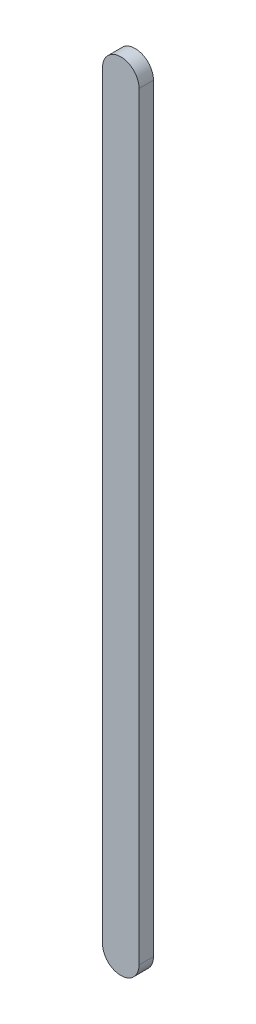
ISO-10303-21;
HEADER;
FILE_DESCRIPTION(('STEP AP214'),'2;1');
FILE_NAME('part.step','',(''),(''),'','','');
FILE_SCHEMA(('AUTOMOTIVE_DESIGN { 1 0 10303 214 1 1 1 1 }'));
ENDSEC;
DATA;
#1=APPLICATION_CONTEXT('core data for automotive mechanical design processes');
#2=APPLICATION_PROTOCOL_DEFINITION('international standard','automotive_design',2000,#1);
#3=PRODUCT_CONTEXT('',#1,'mechanical');
#4=PRODUCT('Part','Part','',(#3));
#5=PRODUCT_RELATED_PRODUCT_CATEGORY('part','',(#4));
#6=PRODUCT_DEFINITION_FORMATION('','',#4);
#7=PRODUCT_DEFINITION_CONTEXT('part definition',#1,'design');
#8=PRODUCT_DEFINITION('design','',#6,#7);
#9=PRODUCT_DEFINITION_SHAPE('','',#8);
#10=(LENGTH_UNIT() NAMED_UNIT(*) SI_UNIT(.MILLI.,.METRE.));
#11=(NAMED_UNIT(*) PLANE_ANGLE_UNIT() SI_UNIT($,.RADIAN.));
#12=(NAMED_UNIT(*) SI_UNIT($,.STERADIAN.) SOLID_ANGLE_UNIT());
#13=UNCERTAINTY_MEASURE_WITH_UNIT(LENGTH_MEASURE(1.E-05),#10,'distance_accuracy_value','');
#14=(GEOMETRIC_REPRESENTATION_CONTEXT(3) GLOBAL_UNCERTAINTY_ASSIGNED_CONTEXT((#13)) GLOBAL_UNIT_ASSIGNED_CONTEXT((#10,
#11,#12)) REPRESENTATION_CONTEXT('',''));
#15=CARTESIAN_POINT('',(0.,0.,0.));
#16=DIRECTION('',(0.,0.,1.));
#17=DIRECTION('',(1.,0.,0.));
#18=AXIS2_PLACEMENT_3D('',#15,#16,#17);
#19=CARTESIAN_POINT('',(151.384,92.075,0.));
#20=DIRECTION('',(-1.,0.,0.));
#21=DIRECTION('',(0.,1.,0.));
#22=AXIS2_PLACEMENT_3D('',#19,#20,#21);
#23=PLANE('',#22);
#24=DIRECTION('',(0.,1.,0.));
#25=VECTOR('',#24,1.);
#26=CARTESIAN_POINT('',(151.384,92.075,0.1999996));
#27=LINE('',#26,#25);
#28=CARTESIAN_POINT('',(151.384,92.075,0.1999996));
#29=VERTEX_POINT('',#28);
#30=CARTESIAN_POINT('',(151.384,102.616,0.1999996));
#31=VERTEX_POINT('',#30);
#32=EDGE_CURVE('E11',#29,#31,#27,.T.);
#33=ORIENTED_EDGE('',*,*,#32,.F.);
#34=DIRECTION('',(0.,0.,1.));
#35=VECTOR('',#34,1.);
#36=CARTESIAN_POINT('',(151.384,92.075,0.));
#37=LINE('',#36,#35);
#38=CARTESIAN_POINT('',(151.384,92.075,0.));
#39=VERTEX_POINT('',#38);
#40=EDGE_CURVE('E24',#39,#29,#37,.T.);
#41=ORIENTED_EDGE('',*,*,#40,.F.);
#42=DIRECTION('',(0.,1.,0.));
#43=VECTOR('',#42,1.);
#44=CARTESIAN_POINT('',(151.384,92.075,0.));
#45=LINE('',#44,#43);
#46=CARTESIAN_POINT('',(151.384,102.616,0.));
#47=VERTEX_POINT('',#46);
#48=EDGE_CURVE('E75',#39,#47,#45,.T.);
#49=ORIENTED_EDGE('',*,*,#48,.T.);
#50=DIRECTION('',(0.,0.,1.));
#51=VECTOR('',#50,1.);
#52=CARTESIAN_POINT('',(151.384,102.616,0.));
#53=LINE('',#52,#51);
#54=EDGE_CURVE('E37',#47,#31,#53,.T.);
#55=ORIENTED_EDGE('',*,*,#54,.T.);
#56=EDGE_LOOP('',(#33,#41,#49,#55));
#57=FACE_BOUND('',#56,.T.);
#58=ADVANCED_FACE('F17',(#57),#23,.F.);
#59=CARTESIAN_POINT('',(151.13,102.616,0.));
#60=DIRECTION('',(0.,0.,-1.));
#61=DIRECTION('',(1.,0.,0.));
#62=AXIS2_PLACEMENT_3D('',#59,#60,#61);
#63=CYLINDRICAL_SURFACE('',#62,0.254);
#64=CARTESIAN_POINT('',(151.13,102.616,0.1999996));
#65=DIRECTION('',(0.,0.,1.));
#66=DIRECTION('',(1.,0.,0.));
#67=AXIS2_PLACEMENT_3D('',#64,#65,#66);
#68=CIRCLE('',#67,0.254);
#69=CARTESIAN_POINT('',(150.876,102.616,0.1999996));
#70=VERTEX_POINT('',#69);
#71=EDGE_CURVE('E83',#31,#70,#68,.T.);
#72=ORIENTED_EDGE('',*,*,#71,.F.);
#73=ORIENTED_EDGE('',*,*,#54,.F.);
#74=CARTESIAN_POINT('',(151.13,102.616,0.));
#75=DIRECTION('',(0.,0.,1.));
#76=DIRECTION('',(1.,0.,0.));
#77=AXIS2_PLACEMENT_3D('',#74,#75,#76);
#78=CIRCLE('',#77,0.254);
#79=CARTESIAN_POINT('',(150.876,102.616,0.));
#80=VERTEX_POINT('',#79);
#81=EDGE_CURVE('E81',#47,#80,#78,.T.);
#82=ORIENTED_EDGE('',*,*,#81,.T.);
#83=DIRECTION('',(0.,0.,1.));
#84=VECTOR('',#83,1.);
#85=CARTESIAN_POINT('',(150.876,102.616,0.));
#86=LINE('',#85,#84);
#87=EDGE_CURVE('E67',#80,#70,#86,.T.);
#88=ORIENTED_EDGE('',*,*,#87,.T.);
#89=EDGE_LOOP('',(#72,#73,#82,#88));
#90=FACE_BOUND('',#89,.T.);
#91=ADVANCED_FACE('F89',(#90),#63,.T.);
#92=CARTESIAN_POINT('',(150.876,102.616,0.));
#93=DIRECTION('',(1.,0.,0.));
#94=DIRECTION('',(0.,-1.,0.));
#95=AXIS2_PLACEMENT_3D('',#92,#93,#94);
#96=PLANE('',#95);
#97=DIRECTION('',(0.,-1.,0.));
#98=VECTOR('',#97,1.);
#99=CARTESIAN_POINT('',(150.876,102.616,0.1999996));
#100=LINE('',#99,#98);
#101=CARTESIAN_POINT('',(150.876,92.075,0.1999996));
#102=VERTEX_POINT('',#101);
#103=EDGE_CURVE('E71',#70,#102,#100,.T.);
#104=ORIENTED_EDGE('',*,*,#103,.F.);
#105=ORIENTED_EDGE('',*,*,#87,.F.);
#106=DIRECTION('',(0.,-1.,0.));
#107=VECTOR('',#106,1.);
#108=CARTESIAN_POINT('',(150.876,102.616,0.));
#109=LINE('',#108,#107);
#110=CARTESIAN_POINT('',(150.876,92.075,0.));
#111=VERTEX_POINT('',#110);
#112=EDGE_CURVE('E63',#80,#111,#109,.T.);
#113=ORIENTED_EDGE('',*,*,#112,.T.);
#114=DIRECTION('',(0.,0.,1.));
#115=VECTOR('',#114,1.);
#116=CARTESIAN_POINT('',(150.876,92.075,0.));
#117=LINE('',#116,#115);
#118=EDGE_CURVE('E53',#111,#102,#117,.T.);
#119=ORIENTED_EDGE('',*,*,#118,.T.);
#120=EDGE_LOOP('',(#104,#105,#113,#119));
#121=FACE_BOUND('',#120,.T.);
#122=ADVANCED_FACE('F66',(#121),#96,.F.);
#123=CARTESIAN_POINT('',(151.13,92.075,0.));
#124=DIRECTION('',(0.,0.,-1.));
#125=DIRECTION('',(-1.,0.,0.));
#126=AXIS2_PLACEMENT_3D('',#123,#124,#125);
#127=CYLINDRICAL_SURFACE('',#126,0.254);
#128=CARTESIAN_POINT('',(151.13,92.075,0.1999996));
#129=DIRECTION('',(0.,0.,1.));
#130=DIRECTION('',(-1.,0.,0.));
#131=AXIS2_PLACEMENT_3D('',#128,#129,#130);
#132=CIRCLE('',#131,0.254);
#133=EDGE_CURVE('E59',#102,#29,#132,.T.);
#134=ORIENTED_EDGE('',*,*,#133,.F.);
#135=ORIENTED_EDGE('',*,*,#118,.F.);
#136=CARTESIAN_POINT('',(151.13,92.075,0.));
#137=DIRECTION('',(0.,0.,1.));
#138=DIRECTION('',(-1.,0.,0.));
#139=AXIS2_PLACEMENT_3D('',#136,#137,#138);
#140=CIRCLE('',#139,0.254);
#141=EDGE_CURVE('E57',#111,#39,#140,.T.);
#142=ORIENTED_EDGE('',*,*,#141,.T.);
#143=ORIENTED_EDGE('',*,*,#40,.T.);
#144=EDGE_LOOP('',(#134,#135,#142,#143));
#145=FACE_BOUND('',#144,.T.);
#146=ADVANCED_FACE('F55',(#145),#127,.T.);
#147=CARTESIAN_POINT('',(151.384,92.075,0.));
#148=DIRECTION('',(0.,0.,-1.));
#149=DIRECTION('',(-1.,0.,0.));
#150=AXIS2_PLACEMENT_3D('',#147,#148,#149);
#151=PLANE('',#150);
#152=ORIENTED_EDGE('',*,*,#141,.F.);
#153=ORIENTED_EDGE('',*,*,#112,.F.);
#154=ORIENTED_EDGE('',*,*,#81,.F.);
#155=ORIENTED_EDGE('',*,*,#48,.F.);
#156=EDGE_LOOP('',(#152,#153,#154,#155));
#157=FACE_BOUND('',#156,.T.);
#158=ADVANCED_FACE('F74',(#157),#151,.T.);
#159=CARTESIAN_POINT('',(151.384,92.075,0.1999996));
#160=DIRECTION('',(0.,0.,-1.));
#161=DIRECTION('',(-1.,0.,0.));
#162=AXIS2_PLACEMENT_3D('',#159,#160,#161);
#163=PLANE('',#162);
#164=ORIENTED_EDGE('',*,*,#32,.T.);
#165=ORIENTED_EDGE('',*,*,#71,.T.);
#166=ORIENTED_EDGE('',*,*,#103,.T.);
#167=ORIENTED_EDGE('',*,*,#133,.T.);
#168=EDGE_LOOP('',(#164,#165,#166,#167));
#169=FACE_BOUND('',#168,.T.);
#170=ADVANCED_FACE('F91',(#169),#163,.F.);
#171=CLOSED_SHELL('',(#58,#91,#122,#146,#158,#170));
#172=MANIFOLD_SOLID_BREP('B1',#171);
#173=ADVANCED_BREP_SHAPE_REPRESENTATION('',(#18,#172),#14);
#174=SHAPE_DEFINITION_REPRESENTATION(#9,#173);
ENDSEC;
END-ISO-10303-21;
